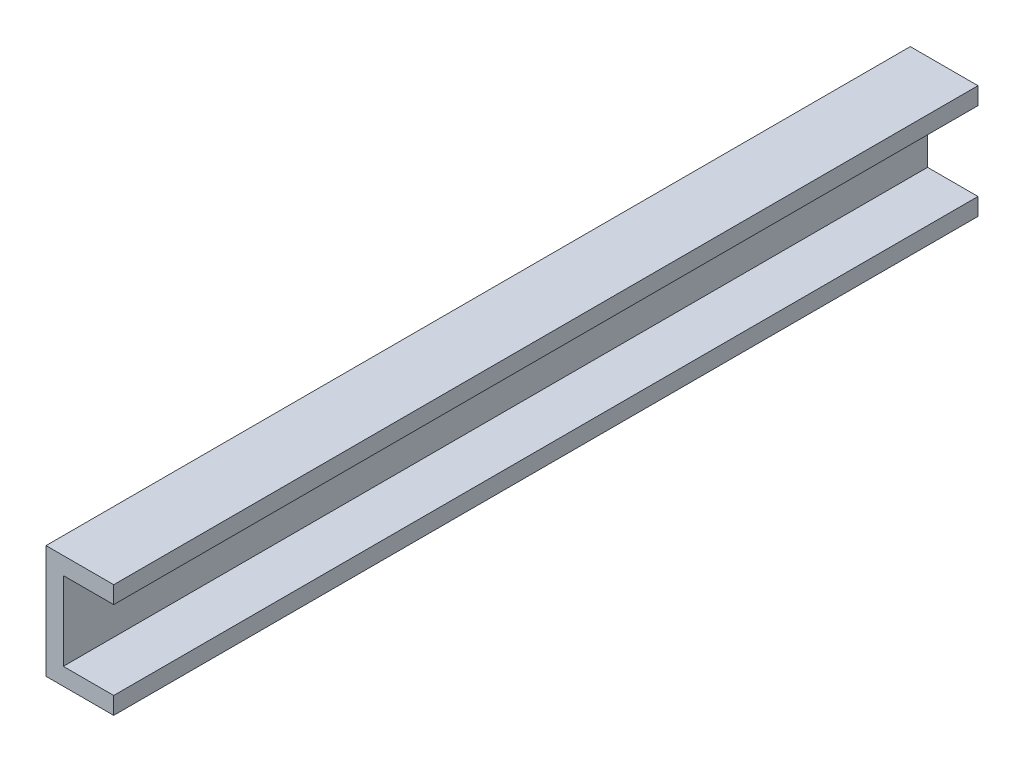
ISO-10303-21;
HEADER;
FILE_DESCRIPTION(('STEP AP214'),'2;1');
FILE_NAME('part.step','',(''),(''),'','','');
FILE_SCHEMA(('AUTOMOTIVE_DESIGN { 1 0 10303 214 1 1 1 1 }'));
ENDSEC;
DATA;
#1=APPLICATION_CONTEXT('core data for automotive mechanical design processes');
#2=APPLICATION_PROTOCOL_DEFINITION('international standard','automotive_design',2000,#1);
#3=PRODUCT_CONTEXT('',#1,'mechanical');
#4=PRODUCT('Part','Part','',(#3));
#5=PRODUCT_RELATED_PRODUCT_CATEGORY('part','',(#4));
#6=PRODUCT_DEFINITION_FORMATION('','',#4);
#7=PRODUCT_DEFINITION_CONTEXT('part definition',#1,'design');
#8=PRODUCT_DEFINITION('design','',#6,#7);
#9=PRODUCT_DEFINITION_SHAPE('','',#8);
#10=(LENGTH_UNIT() NAMED_UNIT(*) SI_UNIT(.MILLI.,.METRE.));
#11=(NAMED_UNIT(*) PLANE_ANGLE_UNIT() SI_UNIT($,.RADIAN.));
#12=(NAMED_UNIT(*) SI_UNIT($,.STERADIAN.) SOLID_ANGLE_UNIT());
#13=UNCERTAINTY_MEASURE_WITH_UNIT(LENGTH_MEASURE(1.E-05),#10,'distance_accuracy_value','');
#14=(GEOMETRIC_REPRESENTATION_CONTEXT(3) GLOBAL_UNCERTAINTY_ASSIGNED_CONTEXT((#13)) GLOBAL_UNIT_ASSIGNED_CONTEXT((#10,
#11,#12)) REPRESENTATION_CONTEXT('',''));
#15=CARTESIAN_POINT('',(0.,0.,0.));
#16=DIRECTION('',(0.,0.,1.));
#17=DIRECTION('',(1.,0.,0.));
#18=AXIS2_PLACEMENT_3D('',#15,#16,#17);
#19=CARTESIAN_POINT('',(-16.8998436228305,4.1292766127094,50.));
#20=DIRECTION('',(1.,0.,0.));
#21=DIRECTION('',(0.,0.,-1.));
#22=AXIS2_PLACEMENT_3D('',#19,#20,#21);
#23=PLANE('',#22);
#24=DIRECTION('',(0.,-1.,0.));
#25=VECTOR('',#24,1.);
#26=CARTESIAN_POINT('',(-16.8998436228305,4.1292766127094,0.));
#27=LINE('',#26,#25);
#28=CARTESIAN_POINT('',(-16.8998436228305,4.1292766127094,0.));
#29=VERTEX_POINT('',#28);
#30=CARTESIAN_POINT('',(-16.8998436228305,-2.42072338729061,0.));
#31=VERTEX_POINT('',#30);
#32=EDGE_CURVE('E130',#29,#31,#27,.T.);
#33=ORIENTED_EDGE('',*,*,#32,.T.);
#34=DIRECTION('',(0.,0.,-1.));
#35=VECTOR('',#34,1.);
#36=CARTESIAN_POINT('',(-16.8998436228305,-2.42072338729061,50.));
#37=LINE('',#36,#35);
#38=CARTESIAN_POINT('',(-16.8998436228305,-2.42072338729061,50.));
#39=VERTEX_POINT('',#38);
#40=EDGE_CURVE('E11',#39,#31,#37,.T.);
#41=ORIENTED_EDGE('',*,*,#40,.F.);
#42=DIRECTION('',(0.,-1.,0.));
#43=VECTOR('',#42,1.);
#44=CARTESIAN_POINT('',(-16.8998436228305,4.1292766127094,50.));
#45=LINE('',#44,#43);
#46=CARTESIAN_POINT('',(-16.8998436228305,4.1292766127094,50.));
#47=VERTEX_POINT('',#46);
#48=EDGE_CURVE('E144',#47,#39,#45,.T.);
#49=ORIENTED_EDGE('',*,*,#48,.F.);
#50=DIRECTION('',(0.,0.,-1.));
#51=VECTOR('',#50,1.);
#52=CARTESIAN_POINT('',(-16.8998436228305,4.1292766127094,50.));
#53=LINE('',#52,#51);
#54=EDGE_CURVE('E126',#47,#29,#53,.T.);
#55=ORIENTED_EDGE('',*,*,#54,.T.);
#56=EDGE_LOOP('',(#33,#41,#49,#55));
#57=FACE_BOUND('',#56,.T.);
#58=ADVANCED_FACE('F34',(#57),#23,.F.);
#59=CARTESIAN_POINT('',(-16.8998436228305,-2.42072338729061,50.));
#60=DIRECTION('',(0.,1.,0.));
#61=DIRECTION('',(0.,0.,1.));
#62=AXIS2_PLACEMENT_3D('',#59,#60,#61);
#63=PLANE('',#62);
#64=DIRECTION('',(1.,0.,0.));
#65=VECTOR('',#64,1.);
#66=CARTESIAN_POINT('',(-16.8998436228305,-2.42072338729061,0.));
#67=LINE('',#66,#65);
#68=CARTESIAN_POINT('',(-12.9824291643034,-2.42072338729061,0.));
#69=VERTEX_POINT('',#68);
#70=EDGE_CURVE('E133',#31,#69,#67,.T.);
#71=ORIENTED_EDGE('',*,*,#70,.T.);
#72=DIRECTION('',(0.,0.,-1.));
#73=VECTOR('',#72,1.);
#74=CARTESIAN_POINT('',(-12.9824291643034,-2.42072338729061,50.));
#75=LINE('',#74,#73);
#76=CARTESIAN_POINT('',(-12.9824291643034,-2.42072338729061,50.));
#77=VERTEX_POINT('',#76);
#78=EDGE_CURVE('E42',#77,#69,#75,.T.);
#79=ORIENTED_EDGE('',*,*,#78,.F.);
#80=DIRECTION('',(1.,0.,0.));
#81=VECTOR('',#80,1.);
#82=CARTESIAN_POINT('',(-16.8998436228305,-2.42072338729061,50.));
#83=LINE('',#82,#81);
#84=EDGE_CURVE('E93',#39,#77,#83,.T.);
#85=ORIENTED_EDGE('',*,*,#84,.F.);
#86=ORIENTED_EDGE('',*,*,#40,.T.);
#87=EDGE_LOOP('',(#71,#79,#85,#86));
#88=FACE_BOUND('',#87,.T.);
#89=ADVANCED_FACE('F179',(#88),#63,.F.);
#90=CARTESIAN_POINT('',(-12.9824291643034,-2.42072338729061,50.));
#91=DIRECTION('',(-1.,0.,0.));
#92=DIRECTION('',(0.,0.,1.));
#93=AXIS2_PLACEMENT_3D('',#90,#91,#92);
#94=PLANE('',#93);
#95=DIRECTION('',(0.,1.,0.));
#96=VECTOR('',#95,1.);
#97=CARTESIAN_POINT('',(-12.9824291643034,-2.42072338729061,0.));
#98=LINE('',#97,#96);
#99=CARTESIAN_POINT('',(-12.9824291643034,-1.42072338729061,0.));
#100=VERTEX_POINT('',#99);
#101=EDGE_CURVE('E135',#69,#100,#98,.T.);
#102=ORIENTED_EDGE('',*,*,#101,.T.);
#103=DIRECTION('',(0.,0.,-1.));
#104=VECTOR('',#103,1.);
#105=CARTESIAN_POINT('',(-12.9824291643034,-1.42072338729061,50.));
#106=LINE('',#105,#104);
#107=CARTESIAN_POINT('',(-12.9824291643034,-1.42072338729061,50.));
#108=VERTEX_POINT('',#107);
#109=EDGE_CURVE('E151',#108,#100,#106,.T.);
#110=ORIENTED_EDGE('',*,*,#109,.F.);
#111=DIRECTION('',(0.,1.,0.));
#112=VECTOR('',#111,1.);
#113=CARTESIAN_POINT('',(-12.9824291643034,-2.42072338729061,50.));
#114=LINE('',#113,#112);
#115=EDGE_CURVE('E159',#77,#108,#114,.T.);
#116=ORIENTED_EDGE('',*,*,#115,.F.);
#117=ORIENTED_EDGE('',*,*,#78,.T.);
#118=EDGE_LOOP('',(#102,#110,#116,#117));
#119=FACE_BOUND('',#118,.T.);
#120=ADVANCED_FACE('F157',(#119),#94,.F.);
#121=CARTESIAN_POINT('',(-12.9824291643034,-1.42072338729061,50.));
#122=DIRECTION('',(0.,-1.,0.));
#123=DIRECTION('',(1.,0.,0.));
#124=AXIS2_PLACEMENT_3D('',#121,#122,#123);
#125=PLANE('',#124);
#126=DIRECTION('',(-1.,0.,0.));
#127=VECTOR('',#126,1.);
#128=CARTESIAN_POINT('',(-12.9824291643034,-1.42072338729061,0.));
#129=LINE('',#128,#127);
#130=CARTESIAN_POINT('',(-15.8998436228305,-1.42072338729061,0.));
#131=VERTEX_POINT('',#130);
#132=EDGE_CURVE('E137',#100,#131,#129,.T.);
#133=ORIENTED_EDGE('',*,*,#132,.T.);
#134=DIRECTION('',(0.,0.,-1.));
#135=VECTOR('',#134,1.);
#136=CARTESIAN_POINT('',(-15.8998436228305,-1.42072338729061,50.));
#137=LINE('',#136,#135);
#138=CARTESIAN_POINT('',(-15.8998436228305,-1.42072338729061,50.));
#139=VERTEX_POINT('',#138);
#140=EDGE_CURVE('E148',#139,#131,#137,.T.);
#141=ORIENTED_EDGE('',*,*,#140,.F.);
#142=DIRECTION('',(-1.,0.,0.));
#143=VECTOR('',#142,1.);
#144=CARTESIAN_POINT('',(-12.9824291643034,-1.42072338729061,50.));
#145=LINE('',#144,#143);
#146=EDGE_CURVE('E171',#108,#139,#145,.T.);
#147=ORIENTED_EDGE('',*,*,#146,.F.);
#148=ORIENTED_EDGE('',*,*,#109,.T.);
#149=EDGE_LOOP('',(#133,#141,#147,#148));
#150=FACE_BOUND('',#149,.T.);
#151=ADVANCED_FACE('F167',(#150),#125,.F.);
#152=CARTESIAN_POINT('',(-15.8998436228305,-1.42072338729061,50.));
#153=DIRECTION('',(-1.,0.,0.));
#154=DIRECTION('',(0.,0.,1.));
#155=AXIS2_PLACEMENT_3D('',#152,#153,#154);
#156=PLANE('',#155);
#157=DIRECTION('',(0.,1.,0.));
#158=VECTOR('',#157,1.);
#159=CARTESIAN_POINT('',(-15.8998436228305,-1.42072338729061,0.));
#160=LINE('',#159,#158);
#161=CARTESIAN_POINT('',(-15.8998436228305,3.12927661270939,0.));
#162=VERTEX_POINT('',#161);
#163=EDGE_CURVE('E139',#131,#162,#160,.T.);
#164=ORIENTED_EDGE('',*,*,#163,.T.);
#165=DIRECTION('',(0.,0.,-1.));
#166=VECTOR('',#165,1.);
#167=CARTESIAN_POINT('',(-15.8998436228305,3.12927661270939,50.));
#168=LINE('',#167,#166);
#169=CARTESIAN_POINT('',(-15.8998436228305,3.12927661270939,50.));
#170=VERTEX_POINT('',#169);
#171=EDGE_CURVE('E121',#170,#162,#168,.T.);
#172=ORIENTED_EDGE('',*,*,#171,.F.);
#173=DIRECTION('',(0.,1.,0.));
#174=VECTOR('',#173,1.);
#175=CARTESIAN_POINT('',(-15.8998436228305,-1.42072338729061,50.));
#176=LINE('',#175,#174);
#177=EDGE_CURVE('E112',#139,#170,#176,.T.);
#178=ORIENTED_EDGE('',*,*,#177,.F.);
#179=ORIENTED_EDGE('',*,*,#140,.T.);
#180=EDGE_LOOP('',(#164,#172,#178,#179));
#181=FACE_BOUND('',#180,.T.);
#182=ADVANCED_FACE('F170',(#181),#156,.F.);
#183=CARTESIAN_POINT('',(-15.8998436228305,3.12927661270939,50.));
#184=DIRECTION('',(0.,1.,0.));
#185=DIRECTION('',(0.,0.,1.));
#186=AXIS2_PLACEMENT_3D('',#183,#184,#185);
#187=PLANE('',#186);
#188=DIRECTION('',(1.,0.,0.));
#189=VECTOR('',#188,1.);
#190=CARTESIAN_POINT('',(-15.8998436228305,3.12927661270939,0.));
#191=LINE('',#190,#189);
#192=CARTESIAN_POINT('',(-12.9824291643034,3.12927661270939,0.));
#193=VERTEX_POINT('',#192);
#194=EDGE_CURVE('E120',#162,#193,#191,.T.);
#195=ORIENTED_EDGE('',*,*,#194,.T.);
#196=DIRECTION('',(0.,0.,-1.));
#197=VECTOR('',#196,1.);
#198=CARTESIAN_POINT('',(-12.9824291643034,3.12927661270939,50.));
#199=LINE('',#198,#197);
#200=CARTESIAN_POINT('',(-12.9824291643034,3.12927661270939,50.));
#201=VERTEX_POINT('',#200);
#202=EDGE_CURVE('E117',#201,#193,#199,.T.);
#203=ORIENTED_EDGE('',*,*,#202,.F.);
#204=DIRECTION('',(1.,0.,0.));
#205=VECTOR('',#204,1.);
#206=CARTESIAN_POINT('',(-15.8998436228305,3.12927661270939,50.));
#207=LINE('',#206,#205);
#208=EDGE_CURVE('E106',#170,#201,#207,.T.);
#209=ORIENTED_EDGE('',*,*,#208,.F.);
#210=ORIENTED_EDGE('',*,*,#171,.T.);
#211=EDGE_LOOP('',(#195,#203,#209,#210));
#212=FACE_BOUND('',#211,.T.);
#213=ADVANCED_FACE('F118',(#212),#187,.F.);
#214=CARTESIAN_POINT('',(-12.9824291643034,3.12927661270939,50.));
#215=DIRECTION('',(-1.,0.,0.));
#216=DIRECTION('',(0.,0.,1.));
#217=AXIS2_PLACEMENT_3D('',#214,#215,#216);
#218=PLANE('',#217);
#219=DIRECTION('',(0.,1.,0.));
#220=VECTOR('',#219,1.);
#221=CARTESIAN_POINT('',(-12.9824291643034,3.12927661270939,0.));
#222=LINE('',#221,#220);
#223=CARTESIAN_POINT('',(-12.9824291643034,4.1292766127094,0.));
#224=VERTEX_POINT('',#223);
#225=EDGE_CURVE('E79',#193,#224,#222,.T.);
#226=ORIENTED_EDGE('',*,*,#225,.T.);
#227=DIRECTION('',(0.,0.,-1.));
#228=VECTOR('',#227,1.);
#229=CARTESIAN_POINT('',(-12.9824291643034,4.1292766127094,50.));
#230=LINE('',#229,#228);
#231=CARTESIAN_POINT('',(-12.9824291643034,4.1292766127094,50.));
#232=VERTEX_POINT('',#231);
#233=EDGE_CURVE('E122',#232,#224,#230,.T.);
#234=ORIENTED_EDGE('',*,*,#233,.F.);
#235=DIRECTION('',(0.,1.,0.));
#236=VECTOR('',#235,1.);
#237=CARTESIAN_POINT('',(-12.9824291643034,3.12927661270939,50.));
#238=LINE('',#237,#236);
#239=EDGE_CURVE('E110',#201,#232,#238,.T.);
#240=ORIENTED_EDGE('',*,*,#239,.F.);
#241=ORIENTED_EDGE('',*,*,#202,.T.);
#242=EDGE_LOOP('',(#226,#234,#240,#241));
#243=FACE_BOUND('',#242,.T.);
#244=ADVANCED_FACE('F124',(#243),#218,.F.);
#245=CARTESIAN_POINT('',(-16.8998436228305,4.1292766127094,50.));
#246=DIRECTION('',(0.,-1.,0.));
#247=DIRECTION('',(0.,0.,-1.));
#248=AXIS2_PLACEMENT_3D('',#245,#246,#247);
#249=PLANE('',#248);
#250=DIRECTION('',(-1.,0.,0.));
#251=VECTOR('',#250,1.);
#252=CARTESIAN_POINT('',(-16.8998436228305,4.1292766127094,0.));
#253=LINE('',#252,#251);
#254=EDGE_CURVE('E85',#224,#29,#253,.T.);
#255=ORIENTED_EDGE('',*,*,#254,.T.);
#256=ORIENTED_EDGE('',*,*,#54,.F.);
#257=DIRECTION('',(-1.,0.,0.));
#258=VECTOR('',#257,1.);
#259=CARTESIAN_POINT('',(-16.8998436228305,4.1292766127094,50.));
#260=LINE('',#259,#258);
#261=EDGE_CURVE('E50',#232,#47,#260,.T.);
#262=ORIENTED_EDGE('',*,*,#261,.F.);
#263=ORIENTED_EDGE('',*,*,#233,.T.);
#264=EDGE_LOOP('',(#255,#256,#262,#263));
#265=FACE_BOUND('',#264,.T.);
#266=ADVANCED_FACE('F195',(#265),#249,.F.);
#267=CARTESIAN_POINT('',(0.,0.,50.));
#268=DIRECTION('',(0.,0.,1.));
#269=DIRECTION('',(1.,0.,0.));
#270=AXIS2_PLACEMENT_3D('',#267,#268,#269);
#271=PLANE('',#270);
#272=ORIENTED_EDGE('',*,*,#48,.T.);
#273=ORIENTED_EDGE('',*,*,#84,.T.);
#274=ORIENTED_EDGE('',*,*,#115,.T.);
#275=ORIENTED_EDGE('',*,*,#146,.T.);
#276=ORIENTED_EDGE('',*,*,#177,.T.);
#277=ORIENTED_EDGE('',*,*,#208,.T.);
#278=ORIENTED_EDGE('',*,*,#239,.T.);
#279=ORIENTED_EDGE('',*,*,#261,.T.);
#280=EDGE_LOOP('',(#272,#273,#274,#275,#276,#277,#278,#279));
#281=FACE_BOUND('',#280,.T.);
#282=ADVANCED_FACE('F108',(#281),#271,.T.);
#283=CARTESIAN_POINT('',(0.,0.,0.));
#284=DIRECTION('',(0.,0.,1.));
#285=DIRECTION('',(1.,0.,0.));
#286=AXIS2_PLACEMENT_3D('',#283,#284,#285);
#287=PLANE('',#286);
#288=ORIENTED_EDGE('',*,*,#32,.F.);
#289=ORIENTED_EDGE('',*,*,#254,.F.);
#290=ORIENTED_EDGE('',*,*,#225,.F.);
#291=ORIENTED_EDGE('',*,*,#194,.F.);
#292=ORIENTED_EDGE('',*,*,#163,.F.);
#293=ORIENTED_EDGE('',*,*,#132,.F.);
#294=ORIENTED_EDGE('',*,*,#101,.F.);
#295=ORIENTED_EDGE('',*,*,#70,.F.);
#296=EDGE_LOOP('',(#288,#289,#290,#291,#292,#293,#294,#295));
#297=FACE_BOUND('',#296,.T.);
#298=ADVANCED_FACE('F163',(#297),#287,.F.);
#299=CLOSED_SHELL('',(#58,#89,#120,#151,#182,#213,#244,#266,#282,#298));
#300=MANIFOLD_SOLID_BREP('B2',#299);
#301=ADVANCED_BREP_SHAPE_REPRESENTATION('',(#18,#300),#14);
#302=SHAPE_DEFINITION_REPRESENTATION(#9,#301);
ENDSEC;
END-ISO-10303-21;
